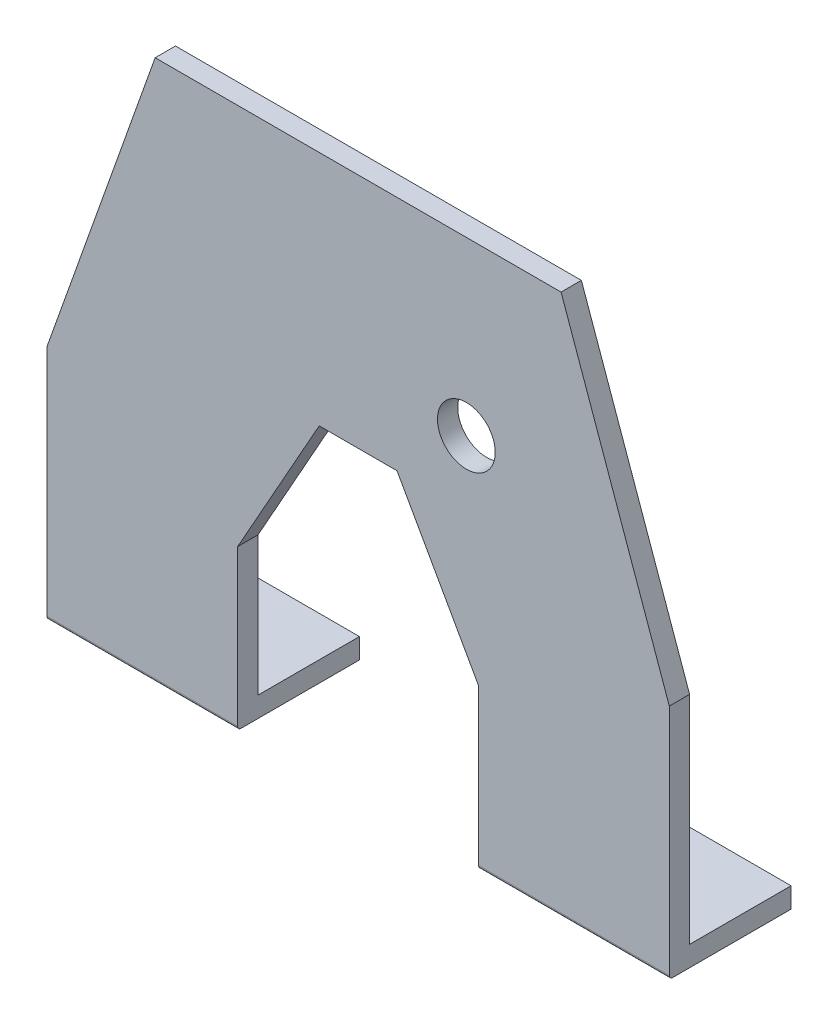
ISO-10303-21;
HEADER;
FILE_DESCRIPTION(('STEP AP214'),'2;1');
FILE_NAME('part.step','',(''),(''),'','','');
FILE_SCHEMA(('AUTOMOTIVE_DESIGN { 1 0 10303 214 1 1 1 1 }'));
ENDSEC;
DATA;
#1=APPLICATION_CONTEXT('core data for automotive mechanical design processes');
#2=APPLICATION_PROTOCOL_DEFINITION('international standard','automotive_design',2000,#1);
#3=PRODUCT_CONTEXT('',#1,'mechanical');
#4=PRODUCT('Part','Part','',(#3));
#5=PRODUCT_RELATED_PRODUCT_CATEGORY('part','',(#4));
#6=PRODUCT_DEFINITION_FORMATION('','',#4);
#7=PRODUCT_DEFINITION_CONTEXT('part definition',#1,'design');
#8=PRODUCT_DEFINITION('design','',#6,#7);
#9=PRODUCT_DEFINITION_SHAPE('','',#8);
#10=(LENGTH_UNIT() NAMED_UNIT(*) SI_UNIT(.MILLI.,.METRE.));
#11=(NAMED_UNIT(*) PLANE_ANGLE_UNIT() SI_UNIT($,.RADIAN.));
#12=(NAMED_UNIT(*) SI_UNIT($,.STERADIAN.) SOLID_ANGLE_UNIT());
#13=UNCERTAINTY_MEASURE_WITH_UNIT(LENGTH_MEASURE(1.E-05),#10,'distance_accuracy_value','');
#14=(GEOMETRIC_REPRESENTATION_CONTEXT(3) GLOBAL_UNCERTAINTY_ASSIGNED_CONTEXT((#13)) GLOBAL_UNIT_ASSIGNED_CONTEXT((#10,
#11,#12)) REPRESENTATION_CONTEXT('',''));
#15=CARTESIAN_POINT('',(0.,0.,0.));
#16=DIRECTION('',(0.,0.,1.));
#17=DIRECTION('',(1.,0.,0.));
#18=AXIS2_PLACEMENT_3D('',#15,#16,#17);
#19=CARTESIAN_POINT('',(0.,0.,0.));
#20=DIRECTION('',(0.,0.,-1.));
#21=DIRECTION('',(-1.,0.,0.));
#22=AXIS2_PLACEMENT_3D('',#19,#20,#21);
#23=PLANE('',#22);
#24=CARTESIAN_POINT('',(16.,14.6,0.));
#25=DIRECTION('',(0.,0.,1.));
#26=DIRECTION('',(1.,0.,0.));
#27=AXIS2_PLACEMENT_3D('',#24,#25,#26);
#28=CIRCLE('',#27,4.27178047631967);
#29=CARTESIAN_POINT('',(20.2717804763197,14.6,0.));
#30=VERTEX_POINT('',#29);
#31=EDGE_CURVE('E210',#30,#30,#28,.T.);
#32=ORIENTED_EDGE('',*,*,#31,.T.);
#33=EDGE_LOOP('',(#32));
#34=FACE_BOUND('',#33,.T.);
#35=DIRECTION('',(0.,1.,0.));
#36=VECTOR('',#35,1.);
#37=CARTESIAN_POINT('',(-17.8038412727349,-16.4842842767622,0.));
#38=LINE('',#37,#36);
#39=CARTESIAN_POINT('',(-17.8038412727349,-37.,0.));
#40=VERTEX_POINT('',#39);
#41=CARTESIAN_POINT('',(-17.8038412727349,-16.4842842767622,0.));
#42=VERTEX_POINT('',#41);
#43=EDGE_CURVE('E251',#40,#42,#38,.T.);
#44=ORIENTED_EDGE('',*,*,#43,.F.);
#45=DIRECTION('',(1.,0.,0.));
#46=VECTOR('',#45,1.);
#47=CARTESIAN_POINT('',(-17.8038412727349,-37.,0.));
#48=LINE('',#47,#46);
#49=CARTESIAN_POINT('',(-46.,-37.,0.));
#50=VERTEX_POINT('',#49);
#51=EDGE_CURVE('E180',#50,#40,#48,.T.);
#52=ORIENTED_EDGE('',*,*,#51,.F.);
#53=DIRECTION('',(0.,-1.,0.));
#54=VECTOR('',#53,1.);
#55=CARTESIAN_POINT('',(-46.,-40.,0.));
#56=LINE('',#55,#54);
#57=CARTESIAN_POINT('',(-46.,-5.,0.));
#58=VERTEX_POINT('',#57);
#59=EDGE_CURVE('E248',#58,#50,#56,.T.);
#60=ORIENTED_EDGE('',*,*,#59,.F.);
#61=DIRECTION('',(-0.335009667654806,-0.942214690279141,0.));
#62=VECTOR('',#61,1.);
#63=CARTESIAN_POINT('',(-46.,-5.,0.));
#64=LINE('',#63,#62);
#65=CARTESIAN_POINT('',(-30.,40.,0.));
#66=VERTEX_POINT('',#65);
#67=EDGE_CURVE('E246',#66,#58,#64,.T.);
#68=ORIENTED_EDGE('',*,*,#67,.F.);
#69=DIRECTION('',(-1.,0.,0.));
#70=VECTOR('',#69,1.);
#71=CARTESIAN_POINT('',(-30.,40.,0.));
#72=LINE('',#71,#70);
#73=CARTESIAN_POINT('',(30.,40.,0.));
#74=VERTEX_POINT('',#73);
#75=EDGE_CURVE('E244',#74,#66,#72,.T.);
#76=ORIENTED_EDGE('',*,*,#75,.F.);
#77=DIRECTION('',(-0.335009667654806,0.942214690279141,0.));
#78=VECTOR('',#77,1.);
#79=CARTESIAN_POINT('',(46.,-4.99999999999999,0.));
#80=LINE('',#79,#78);
#81=CARTESIAN_POINT('',(46.,-4.99999999999999,0.));
#82=VERTEX_POINT('',#81);
#83=EDGE_CURVE('E214',#82,#74,#80,.T.);
#84=ORIENTED_EDGE('',*,*,#83,.F.);
#85=DIRECTION('',(0.,1.,0.));
#86=VECTOR('',#85,1.);
#87=CARTESIAN_POINT('',(46.,-40.,0.));
#88=LINE('',#87,#86);
#89=CARTESIAN_POINT('',(46.,-37.,0.));
#90=VERTEX_POINT('',#89);
#91=EDGE_CURVE('E221',#90,#82,#88,.T.);
#92=ORIENTED_EDGE('',*,*,#91,.F.);
#93=DIRECTION('',(1.,0.,0.));
#94=VECTOR('',#93,1.);
#95=CARTESIAN_POINT('',(46.,-37.,0.));
#96=LINE('',#95,#94);
#97=CARTESIAN_POINT('',(17.8038412727349,-37.,0.));
#98=VERTEX_POINT('',#97);
#99=EDGE_CURVE('E191',#98,#90,#96,.T.);
#100=ORIENTED_EDGE('',*,*,#99,.F.);
#101=DIRECTION('',(0.,-1.,0.));
#102=VECTOR('',#101,1.);
#103=CARTESIAN_POINT('',(17.8038412727349,-16.4842842767622,0.));
#104=LINE('',#103,#102);
#105=CARTESIAN_POINT('',(17.8038412727349,-16.4842842767622,0.));
#106=VERTEX_POINT('',#105);
#107=EDGE_CURVE('E259',#106,#98,#104,.T.);
#108=ORIENTED_EDGE('',*,*,#107,.F.);
#109=DIRECTION('',(0.489302901490051,-0.872113909184699,0.));
#110=VECTOR('',#109,1.);
#111=CARTESIAN_POINT('',(17.8038412727349,-16.4842842767622,0.));
#112=LINE('',#111,#110);
#113=CARTESIAN_POINT('',(5.74999999999989,5.,0.));
#114=VERTEX_POINT('',#113);
#115=EDGE_CURVE('E257',#114,#106,#112,.T.);
#116=ORIENTED_EDGE('',*,*,#115,.F.);
#117=DIRECTION('',(1.,0.,0.));
#118=VECTOR('',#117,1.);
#119=CARTESIAN_POINT('',(-5.74999999999989,5.,0.));
#120=LINE('',#119,#118);
#121=CARTESIAN_POINT('',(-5.74999999999989,5.,0.));
#122=VERTEX_POINT('',#121);
#123=EDGE_CURVE('E255',#122,#114,#120,.T.);
#124=ORIENTED_EDGE('',*,*,#123,.F.);
#125=DIRECTION('',(0.489302901490051,0.872113909184699,0.));
#126=VECTOR('',#125,1.);
#127=CARTESIAN_POINT('',(-17.8038412727349,-16.4842842767622,0.));
#128=LINE('',#127,#126);
#129=EDGE_CURVE('E253',#42,#122,#128,.T.);
#130=ORIENTED_EDGE('',*,*,#129,.F.);
#131=EDGE_LOOP('',(#44,#52,#60,#68,#76,#84,#92,#100,#108,#116,#124,#130));
#132=FACE_BOUND('',#131,.T.);
#133=ADVANCED_FACE('F33',(#34,#132),#23,.T.);
#134=CARTESIAN_POINT('',(0.,0.,3.));
#135=DIRECTION('',(0.,0.,-1.));
#136=DIRECTION('',(-1.,0.,0.));
#137=AXIS2_PLACEMENT_3D('',#134,#135,#136);
#138=PLANE('',#137);
#139=DIRECTION('',(0.,-1.,0.));
#140=VECTOR('',#139,1.);
#141=CARTESIAN_POINT('',(-46.,-40.,3.));
#142=LINE('',#141,#140);
#143=CARTESIAN_POINT('',(-46.,-5.,3.));
#144=VERTEX_POINT('',#143);
#145=CARTESIAN_POINT('',(-46.,-39.5,3.));
#146=VERTEX_POINT('',#145);
#147=EDGE_CURVE('E225',#144,#146,#142,.T.);
#148=ORIENTED_EDGE('',*,*,#147,.T.);
#149=DIRECTION('',(1.,0.,0.));
#150=VECTOR('',#149,1.);
#151=CARTESIAN_POINT('',(0.,-39.5,3.));
#152=LINE('',#151,#150);
#153=CARTESIAN_POINT('',(-17.8038412727349,-39.5,3.));
#154=VERTEX_POINT('',#153);
#155=EDGE_CURVE('E293',#146,#154,#152,.T.);
#156=ORIENTED_EDGE('',*,*,#155,.T.);
#157=DIRECTION('',(0.,1.,0.));
#158=VECTOR('',#157,1.);
#159=CARTESIAN_POINT('',(-17.8038412727349,-16.4842842767622,3.));
#160=LINE('',#159,#158);
#161=CARTESIAN_POINT('',(-17.8038412727349,-16.4842842767622,3.));
#162=VERTEX_POINT('',#161);
#163=EDGE_CURVE('E228',#154,#162,#160,.T.);
#164=ORIENTED_EDGE('',*,*,#163,.T.);
#165=DIRECTION('',(0.489302901490051,0.872113909184699,0.));
#166=VECTOR('',#165,1.);
#167=CARTESIAN_POINT('',(-17.8038412727349,-16.4842842767622,3.));
#168=LINE('',#167,#166);
#169=CARTESIAN_POINT('',(-5.74999999999989,5.,3.));
#170=VERTEX_POINT('',#169);
#171=EDGE_CURVE('E230',#162,#170,#168,.T.);
#172=ORIENTED_EDGE('',*,*,#171,.T.);
#173=DIRECTION('',(1.,0.,0.));
#174=VECTOR('',#173,1.);
#175=CARTESIAN_POINT('',(-5.74999999999989,5.,3.));
#176=LINE('',#175,#174);
#177=CARTESIAN_POINT('',(5.74999999999989,5.,3.));
#178=VERTEX_POINT('',#177);
#179=EDGE_CURVE('E232',#170,#178,#176,.T.);
#180=ORIENTED_EDGE('',*,*,#179,.T.);
#181=DIRECTION('',(0.489302901490051,-0.872113909184699,0.));
#182=VECTOR('',#181,1.);
#183=CARTESIAN_POINT('',(17.8038412727349,-16.4842842767622,3.));
#184=LINE('',#183,#182);
#185=CARTESIAN_POINT('',(17.8038412727349,-16.4842842767622,3.));
#186=VERTEX_POINT('',#185);
#187=EDGE_CURVE('E234',#178,#186,#184,.T.);
#188=ORIENTED_EDGE('',*,*,#187,.T.);
#189=DIRECTION('',(0.,-1.,0.));
#190=VECTOR('',#189,1.);
#191=CARTESIAN_POINT('',(17.8038412727349,-16.4842842767622,3.));
#192=LINE('',#191,#190);
#193=CARTESIAN_POINT('',(17.8038412727349,-39.5,3.));
#194=VERTEX_POINT('',#193);
#195=EDGE_CURVE('E236',#186,#194,#192,.T.);
#196=ORIENTED_EDGE('',*,*,#195,.T.);
#197=DIRECTION('',(1.,0.,0.));
#198=VECTOR('',#197,1.);
#199=CARTESIAN_POINT('',(0.,-39.5,3.));
#200=LINE('',#199,#198);
#201=CARTESIAN_POINT('',(46.,-39.5,3.));
#202=VERTEX_POINT('',#201);
#203=EDGE_CURVE('E290',#194,#202,#200,.T.);
#204=ORIENTED_EDGE('',*,*,#203,.T.);
#205=DIRECTION('',(0.,1.,0.));
#206=VECTOR('',#205,1.);
#207=CARTESIAN_POINT('',(46.,-40.,3.));
#208=LINE('',#207,#206);
#209=CARTESIAN_POINT('',(46.,-4.99999999999999,3.));
#210=VERTEX_POINT('',#209);
#211=EDGE_CURVE('E239',#202,#210,#208,.T.);
#212=ORIENTED_EDGE('',*,*,#211,.T.);
#213=DIRECTION('',(-0.335009667654806,0.942214690279141,0.));
#214=VECTOR('',#213,1.);
#215=CARTESIAN_POINT('',(46.,-4.99999999999999,3.));
#216=LINE('',#215,#214);
#217=CARTESIAN_POINT('',(30.,40.,3.));
#218=VERTEX_POINT('',#217);
#219=EDGE_CURVE('E217',#210,#218,#216,.T.);
#220=ORIENTED_EDGE('',*,*,#219,.T.);
#221=DIRECTION('',(-1.,0.,0.));
#222=VECTOR('',#221,1.);
#223=CARTESIAN_POINT('',(-30.,40.,3.));
#224=LINE('',#223,#222);
#225=CARTESIAN_POINT('',(-30.,40.,3.));
#226=VERTEX_POINT('',#225);
#227=EDGE_CURVE('E220',#218,#226,#224,.T.);
#228=ORIENTED_EDGE('',*,*,#227,.T.);
#229=DIRECTION('',(-0.335009667654806,-0.942214690279141,0.));
#230=VECTOR('',#229,1.);
#231=CARTESIAN_POINT('',(-46.,-5.,3.));
#232=LINE('',#231,#230);
#233=EDGE_CURVE('E223',#226,#144,#232,.T.);
#234=ORIENTED_EDGE('',*,*,#233,.T.);
#235=EDGE_LOOP('',(#148,#156,#164,#172,#180,#188,#196,#204,#212,#220,#228,#234));
#236=FACE_BOUND('',#235,.T.);
#237=CARTESIAN_POINT('',(16.,14.6,3.));
#238=DIRECTION('',(0.,0.,1.));
#239=DIRECTION('',(1.,0.,0.));
#240=AXIS2_PLACEMENT_3D('',#237,#238,#239);
#241=CIRCLE('',#240,4.27178047631967);
#242=CARTESIAN_POINT('',(20.2717804763197,14.6,3.));
#243=VERTEX_POINT('',#242);
#244=EDGE_CURVE('E211',#243,#243,#241,.T.);
#245=ORIENTED_EDGE('',*,*,#244,.F.);
#246=EDGE_LOOP('',(#245));
#247=FACE_BOUND('',#246,.T.);
#248=ADVANCED_FACE('F308',(#236,#247),#138,.F.);
#249=CARTESIAN_POINT('',(46.,-4.99999999999999,3.));
#250=DIRECTION('',(-0.94221469027914,-0.335009667654806,0.));
#251=DIRECTION('',(0.335009667654806,-0.942214690279141,0.));
#252=AXIS2_PLACEMENT_3D('',#249,#250,#251);
#253=PLANE('',#252);
#254=ORIENTED_EDGE('',*,*,#83,.T.);
#255=DIRECTION('',(0.,0.,-1.));
#256=VECTOR('',#255,1.);
#257=CARTESIAN_POINT('',(30.,40.,3.));
#258=LINE('',#257,#256);
#259=EDGE_CURVE('E287',#218,#74,#258,.T.);
#260=ORIENTED_EDGE('',*,*,#259,.F.);
#261=ORIENTED_EDGE('',*,*,#219,.F.);
#262=DIRECTION('',(0.,0.,-1.));
#263=VECTOR('',#262,1.);
#264=CARTESIAN_POINT('',(46.,-4.99999999999999,3.));
#265=LINE('',#264,#263);
#266=EDGE_CURVE('E241',#210,#82,#265,.T.);
#267=ORIENTED_EDGE('',*,*,#266,.T.);
#268=EDGE_LOOP('',(#254,#260,#261,#267));
#269=FACE_BOUND('',#268,.T.);
#270=ADVANCED_FACE('F328',(#269),#253,.F.);
#271=CARTESIAN_POINT('',(-30.,40.,3.));
#272=DIRECTION('',(0.,-1.,0.));
#273=DIRECTION('',(1.,0.,0.));
#274=AXIS2_PLACEMENT_3D('',#271,#272,#273);
#275=PLANE('',#274);
#276=ORIENTED_EDGE('',*,*,#75,.T.);
#277=DIRECTION('',(0.,0.,-1.));
#278=VECTOR('',#277,1.);
#279=CARTESIAN_POINT('',(-30.,40.,3.));
#280=LINE('',#279,#278);
#281=EDGE_CURVE('E284',#226,#66,#280,.T.);
#282=ORIENTED_EDGE('',*,*,#281,.F.);
#283=ORIENTED_EDGE('',*,*,#227,.F.);
#284=ORIENTED_EDGE('',*,*,#259,.T.);
#285=EDGE_LOOP('',(#276,#282,#283,#284));
#286=FACE_BOUND('',#285,.T.);
#287=ADVANCED_FACE('F365',(#286),#275,.F.);
#288=CARTESIAN_POINT('',(-46.,-5.,3.));
#289=DIRECTION('',(0.94221469027914,-0.335009667654805,0.));
#290=DIRECTION('',(0.335009667654805,0.942214690279141,0.));
#291=AXIS2_PLACEMENT_3D('',#288,#289,#290);
#292=PLANE('',#291);
#293=ORIENTED_EDGE('',*,*,#67,.T.);
#294=DIRECTION('',(0.,0.,-1.));
#295=VECTOR('',#294,1.);
#296=CARTESIAN_POINT('',(-46.,-5.,3.));
#297=LINE('',#296,#295);
#298=EDGE_CURVE('E281',#144,#58,#297,.T.);
#299=ORIENTED_EDGE('',*,*,#298,.F.);
#300=ORIENTED_EDGE('',*,*,#233,.F.);
#301=ORIENTED_EDGE('',*,*,#281,.T.);
#302=EDGE_LOOP('',(#293,#299,#300,#301));
#303=FACE_BOUND('',#302,.T.);
#304=ADVANCED_FACE('F362',(#303),#292,.F.);
#305=CARTESIAN_POINT('',(-46.,-40.,3.));
#306=DIRECTION('',(1.,0.,0.));
#307=DIRECTION('',(0.,0.,-1.));
#308=AXIS2_PLACEMENT_3D('',#305,#306,#307);
#309=PLANE('',#308);
#310=DIRECTION('',(0.,0.,-1.));
#311=VECTOR('',#310,1.);
#312=CARTESIAN_POINT('',(-46.,-40.,3.));
#313=LINE('',#312,#311);
#314=CARTESIAN_POINT('',(-46.,-40.,2.5));
#315=VERTEX_POINT('',#314);
#316=CARTESIAN_POINT('',(-46.,-40.,-15.));
#317=VERTEX_POINT('',#316);
#318=EDGE_CURVE('E165',#315,#317,#313,.T.);
#319=ORIENTED_EDGE('',*,*,#318,.F.);
#320=CARTESIAN_POINT('',(-46.,-39.5,2.5));
#321=DIRECTION('',(1.,0.,0.));
#322=DIRECTION('',(0.,0.,-1.));
#323=AXIS2_PLACEMENT_3D('',#320,#321,#322);
#324=CIRCLE('',#323,0.5);
#325=EDGE_CURVE('E299',#315,#146,#324,.F.);
#326=ORIENTED_EDGE('',*,*,#325,.T.);
#327=ORIENTED_EDGE('',*,*,#147,.F.);
#328=ORIENTED_EDGE('',*,*,#298,.T.);
#329=ORIENTED_EDGE('',*,*,#59,.T.);
#330=DIRECTION('',(0.,0.,1.));
#331=VECTOR('',#330,1.);
#332=CARTESIAN_POINT('',(-46.,-37.,-15.));
#333=LINE('',#332,#331);
#334=CARTESIAN_POINT('',(-46.,-37.,-15.));
#335=VERTEX_POINT('',#334);
#336=EDGE_CURVE('E189',#335,#50,#333,.T.);
#337=ORIENTED_EDGE('',*,*,#336,.F.);
#338=DIRECTION('',(0.,1.,0.));
#339=VECTOR('',#338,1.);
#340=CARTESIAN_POINT('',(-46.,-40.,-15.));
#341=LINE('',#340,#339);
#342=EDGE_CURVE('E174',#317,#335,#341,.T.);
#343=ORIENTED_EDGE('',*,*,#342,.F.);
#344=EDGE_LOOP('',(#319,#326,#327,#328,#329,#337,#343));
#345=FACE_BOUND('',#344,.T.);
#346=ADVANCED_FACE('F304',(#345),#309,.F.);
#347=CARTESIAN_POINT('',(-46.,-40.,3.));
#348=DIRECTION('',(0.,1.,0.));
#349=DIRECTION('',(0.,0.,1.));
#350=AXIS2_PLACEMENT_3D('',#347,#348,#349);
#351=PLANE('',#350);
#352=DIRECTION('',(0.,0.,-1.));
#353=VECTOR('',#352,1.);
#354=CARTESIAN_POINT('',(-17.8038412727349,-40.,3.));
#355=LINE('',#354,#353);
#356=CARTESIAN_POINT('',(-17.8038412727349,-40.,2.5));
#357=VERTEX_POINT('',#356);
#358=CARTESIAN_POINT('',(-17.8038412727349,-40.,-15.));
#359=VERTEX_POINT('',#358);
#360=EDGE_CURVE('E156',#357,#359,#355,.T.);
#361=ORIENTED_EDGE('',*,*,#360,.F.);
#362=DIRECTION('',(1.,0.,0.));
#363=VECTOR('',#362,1.);
#364=CARTESIAN_POINT('',(-46.,-40.,2.5));
#365=LINE('',#364,#363);
#366=EDGE_CURVE('E297',#357,#315,#365,.F.);
#367=ORIENTED_EDGE('',*,*,#366,.T.);
#368=ORIENTED_EDGE('',*,*,#318,.T.);
#369=DIRECTION('',(-1.,0.,0.));
#370=VECTOR('',#369,1.);
#371=CARTESIAN_POINT('',(-17.8038412727349,-40.,-15.));
#372=LINE('',#371,#370);
#373=EDGE_CURVE('E169',#359,#317,#372,.T.);
#374=ORIENTED_EDGE('',*,*,#373,.F.);
#375=EDGE_LOOP('',(#361,#367,#368,#374));
#376=FACE_BOUND('',#375,.T.);
#377=ADVANCED_FACE('F170',(#376),#351,.F.);
#378=CARTESIAN_POINT('',(-17.8038412727349,-16.4842842767622,3.));
#379=DIRECTION('',(-1.,0.,0.));
#380=DIRECTION('',(0.,0.,1.));
#381=AXIS2_PLACEMENT_3D('',#378,#379,#380);
#382=PLANE('',#381);
#383=ORIENTED_EDGE('',*,*,#163,.F.);
#384=CARTESIAN_POINT('',(-17.8038412727349,-39.5,2.5));
#385=DIRECTION('',(-1.,0.,0.));
#386=DIRECTION('',(0.,0.,1.));
#387=AXIS2_PLACEMENT_3D('',#384,#385,#386);
#388=CIRCLE('',#387,0.5);
#389=EDGE_CURVE('E162',#154,#357,#388,.F.);
#390=ORIENTED_EDGE('',*,*,#389,.T.);
#391=ORIENTED_EDGE('',*,*,#360,.T.);
#392=DIRECTION('',(0.,-1.,0.));
#393=VECTOR('',#392,1.);
#394=CARTESIAN_POINT('',(-17.8038412727349,-40.,-15.));
#395=LINE('',#394,#393);
#396=CARTESIAN_POINT('',(-17.8038412727349,-37.,-15.));
#397=VERTEX_POINT('',#396);
#398=EDGE_CURVE('E161',#397,#359,#395,.T.);
#399=ORIENTED_EDGE('',*,*,#398,.F.);
#400=DIRECTION('',(0.,0.,1.));
#401=VECTOR('',#400,1.);
#402=CARTESIAN_POINT('',(-17.8038412727349,-37.,-15.));
#403=LINE('',#402,#401);
#404=EDGE_CURVE('E186',#397,#40,#403,.T.);
#405=ORIENTED_EDGE('',*,*,#404,.T.);
#406=ORIENTED_EDGE('',*,*,#43,.T.);
#407=DIRECTION('',(0.,0.,-1.));
#408=VECTOR('',#407,1.);
#409=CARTESIAN_POINT('',(-17.8038412727349,-16.4842842767622,3.));
#410=LINE('',#409,#408);
#411=EDGE_CURVE('E166',#162,#42,#410,.T.);
#412=ORIENTED_EDGE('',*,*,#411,.F.);
#413=EDGE_LOOP('',(#383,#390,#391,#399,#405,#406,#412));
#414=FACE_BOUND('',#413,.T.);
#415=ADVANCED_FACE('F159',(#414),#382,.F.);
#416=CARTESIAN_POINT('',(-17.8038412727349,-16.4842842767622,3.));
#417=DIRECTION('',(-0.872113909184699,0.48930290149005,0.));
#418=DIRECTION('',(-0.489302901490051,-0.872113909184699,0.));
#419=AXIS2_PLACEMENT_3D('',#416,#417,#418);
#420=PLANE('',#419);
#421=ORIENTED_EDGE('',*,*,#129,.T.);
#422=DIRECTION('',(0.,0.,-1.));
#423=VECTOR('',#422,1.);
#424=CARTESIAN_POINT('',(-5.74999999999989,5.,3.));
#425=LINE('',#424,#423);
#426=EDGE_CURVE('E275',#170,#122,#425,.T.);
#427=ORIENTED_EDGE('',*,*,#426,.F.);
#428=ORIENTED_EDGE('',*,*,#171,.F.);
#429=ORIENTED_EDGE('',*,*,#411,.T.);
#430=EDGE_LOOP('',(#421,#427,#428,#429));
#431=FACE_BOUND('',#430,.T.);
#432=ADVANCED_FACE('F351',(#431),#420,.F.);
#433=CARTESIAN_POINT('',(-5.74999999999989,5.,3.));
#434=DIRECTION('',(0.,1.,0.));
#435=DIRECTION('',(-1.,0.,0.));
#436=AXIS2_PLACEMENT_3D('',#433,#434,#435);
#437=PLANE('',#436);
#438=ORIENTED_EDGE('',*,*,#123,.T.);
#439=DIRECTION('',(0.,0.,-1.));
#440=VECTOR('',#439,1.);
#441=CARTESIAN_POINT('',(5.74999999999989,5.,3.));
#442=LINE('',#441,#440);
#443=EDGE_CURVE('E272',#178,#114,#442,.T.);
#444=ORIENTED_EDGE('',*,*,#443,.F.);
#445=ORIENTED_EDGE('',*,*,#179,.F.);
#446=ORIENTED_EDGE('',*,*,#426,.T.);
#447=EDGE_LOOP('',(#438,#444,#445,#446));
#448=FACE_BOUND('',#447,.T.);
#449=ADVANCED_FACE('F347',(#448),#437,.F.);
#450=CARTESIAN_POINT('',(17.8038412727349,-16.4842842767622,3.));
#451=DIRECTION('',(0.872113909184699,0.489302901490051,0.));
#452=DIRECTION('',(-0.489302901490051,0.872113909184699,0.));
#453=AXIS2_PLACEMENT_3D('',#450,#451,#452);
#454=PLANE('',#453);
#455=ORIENTED_EDGE('',*,*,#115,.T.);
#456=DIRECTION('',(0.,0.,-1.));
#457=VECTOR('',#456,1.);
#458=CARTESIAN_POINT('',(17.8038412727349,-16.4842842767622,3.));
#459=LINE('',#458,#457);
#460=EDGE_CURVE('E269',#186,#106,#459,.T.);
#461=ORIENTED_EDGE('',*,*,#460,.F.);
#462=ORIENTED_EDGE('',*,*,#187,.F.);
#463=ORIENTED_EDGE('',*,*,#443,.T.);
#464=EDGE_LOOP('',(#455,#461,#462,#463));
#465=FACE_BOUND('',#464,.T.);
#466=ADVANCED_FACE('F343',(#465),#454,.F.);
#467=CARTESIAN_POINT('',(17.8038412727349,-16.4842842767622,3.));
#468=DIRECTION('',(1.,0.,0.));
#469=DIRECTION('',(0.,0.,-1.));
#470=AXIS2_PLACEMENT_3D('',#467,#468,#469);
#471=PLANE('',#470);
#472=DIRECTION('',(0.,0.,-1.));
#473=VECTOR('',#472,1.);
#474=CARTESIAN_POINT('',(17.8038412727349,-40.,3.));
#475=LINE('',#474,#473);
#476=CARTESIAN_POINT('',(17.8038412727349,-40.,2.5));
#477=VERTEX_POINT('',#476);
#478=CARTESIAN_POINT('',(17.8038412727349,-40.,-15.));
#479=VERTEX_POINT('',#478);
#480=EDGE_CURVE('E267',#477,#479,#475,.T.);
#481=ORIENTED_EDGE('',*,*,#480,.F.);
#482=CARTESIAN_POINT('',(17.8038412727349,-39.5,2.5));
#483=DIRECTION('',(1.,0.,0.));
#484=DIRECTION('',(0.,0.,-1.));
#485=AXIS2_PLACEMENT_3D('',#482,#483,#484);
#486=CIRCLE('',#485,0.5);
#487=EDGE_CURVE('E11',#477,#194,#486,.F.);
#488=ORIENTED_EDGE('',*,*,#487,.T.);
#489=ORIENTED_EDGE('',*,*,#195,.F.);
#490=ORIENTED_EDGE('',*,*,#460,.T.);
#491=ORIENTED_EDGE('',*,*,#107,.T.);
#492=DIRECTION('',(0.,0.,1.));
#493=VECTOR('',#492,1.);
#494=CARTESIAN_POINT('',(17.8038412727349,-37.,-15.));
#495=LINE('',#494,#493);
#496=CARTESIAN_POINT('',(17.8038412727349,-37.,-15.));
#497=VERTEX_POINT('',#496);
#498=EDGE_CURVE('E207',#497,#98,#495,.T.);
#499=ORIENTED_EDGE('',*,*,#498,.F.);
#500=DIRECTION('',(0.,1.,0.));
#501=VECTOR('',#500,1.);
#502=CARTESIAN_POINT('',(17.8038412727349,-40.,-15.));
#503=LINE('',#502,#501);
#504=EDGE_CURVE('E198',#479,#497,#503,.T.);
#505=ORIENTED_EDGE('',*,*,#504,.F.);
#506=EDGE_LOOP('',(#481,#488,#489,#490,#491,#499,#505));
#507=FACE_BOUND('',#506,.T.);
#508=ADVANCED_FACE('F340',(#507),#471,.F.);
#509=CARTESIAN_POINT('',(17.8038412727349,-40.,3.));
#510=DIRECTION('',(0.,1.,0.));
#511=DIRECTION('',(-1.,0.,0.));
#512=AXIS2_PLACEMENT_3D('',#509,#510,#511);
#513=PLANE('',#512);
#514=DIRECTION('',(0.,0.,-1.));
#515=VECTOR('',#514,1.);
#516=CARTESIAN_POINT('',(46.,-40.,3.));
#517=LINE('',#516,#515);
#518=CARTESIAN_POINT('',(46.,-40.,2.5));
#519=VERTEX_POINT('',#518);
#520=CARTESIAN_POINT('',(46.,-40.,-15.));
#521=VERTEX_POINT('',#520);
#522=EDGE_CURVE('E265',#519,#521,#517,.T.);
#523=ORIENTED_EDGE('',*,*,#522,.F.);
#524=DIRECTION('',(1.,0.,0.));
#525=VECTOR('',#524,1.);
#526=CARTESIAN_POINT('',(17.8038412727349,-40.,2.5));
#527=LINE('',#526,#525);
#528=EDGE_CURVE('E41',#519,#477,#527,.F.);
#529=ORIENTED_EDGE('',*,*,#528,.T.);
#530=ORIENTED_EDGE('',*,*,#480,.T.);
#531=DIRECTION('',(-1.,0.,0.));
#532=VECTOR('',#531,1.);
#533=CARTESIAN_POINT('',(46.,-40.,-15.));
#534=LINE('',#533,#532);
#535=EDGE_CURVE('E195',#521,#479,#534,.T.);
#536=ORIENTED_EDGE('',*,*,#535,.F.);
#537=EDGE_LOOP('',(#523,#529,#530,#536));
#538=FACE_BOUND('',#537,.T.);
#539=ADVANCED_FACE('F337',(#538),#513,.F.);
#540=CARTESIAN_POINT('',(46.,-40.,3.));
#541=DIRECTION('',(-1.,0.,0.));
#542=DIRECTION('',(0.,0.,1.));
#543=AXIS2_PLACEMENT_3D('',#540,#541,#542);
#544=PLANE('',#543);
#545=ORIENTED_EDGE('',*,*,#211,.F.);
#546=CARTESIAN_POINT('',(46.,-39.5,2.5));
#547=DIRECTION('',(-1.,0.,0.));
#548=DIRECTION('',(0.,0.,1.));
#549=AXIS2_PLACEMENT_3D('',#546,#547,#548);
#550=CIRCLE('',#549,0.5);
#551=EDGE_CURVE('E55',#202,#519,#550,.F.);
#552=ORIENTED_EDGE('',*,*,#551,.T.);
#553=ORIENTED_EDGE('',*,*,#522,.T.);
#554=DIRECTION('',(0.,-1.,0.));
#555=VECTOR('',#554,1.);
#556=CARTESIAN_POINT('',(46.,-40.,-15.));
#557=LINE('',#556,#555);
#558=CARTESIAN_POINT('',(46.,-37.,-15.));
#559=VERTEX_POINT('',#558);
#560=EDGE_CURVE('E192',#559,#521,#557,.T.);
#561=ORIENTED_EDGE('',*,*,#560,.F.);
#562=DIRECTION('',(0.,0.,1.));
#563=VECTOR('',#562,1.);
#564=CARTESIAN_POINT('',(46.,-37.,-15.));
#565=LINE('',#564,#563);
#566=EDGE_CURVE('E202',#559,#90,#565,.T.);
#567=ORIENTED_EDGE('',*,*,#566,.T.);
#568=ORIENTED_EDGE('',*,*,#91,.T.);
#569=ORIENTED_EDGE('',*,*,#266,.F.);
#570=EDGE_LOOP('',(#545,#552,#553,#561,#567,#568,#569));
#571=FACE_BOUND('',#570,.T.);
#572=ADVANCED_FACE('F333',(#571),#544,.F.);
#573=CARTESIAN_POINT('',(16.,14.6,3.));
#574=DIRECTION('',(0.,0.,-1.));
#575=DIRECTION('',(-1.,0.,0.));
#576=AXIS2_PLACEMENT_3D('',#573,#574,#575);
#577=CYLINDRICAL_SURFACE('',#576,4.27178047631967);
#578=ORIENTED_EDGE('',*,*,#244,.T.);
#579=EDGE_LOOP('',(#578));
#580=FACE_BOUND('',#579,.T.);
#581=ORIENTED_EDGE('',*,*,#31,.F.);
#582=EDGE_LOOP('',(#581));
#583=FACE_BOUND('',#582,.T.);
#584=ADVANCED_FACE('F336',(#580,#583),#577,.F.);
#585=CARTESIAN_POINT('',(46.,-37.,-15.));
#586=DIRECTION('',(0.,-1.,0.));
#587=DIRECTION('',(0.,0.,-1.));
#588=AXIS2_PLACEMENT_3D('',#585,#586,#587);
#589=PLANE('',#588);
#590=ORIENTED_EDGE('',*,*,#99,.T.);
#591=ORIENTED_EDGE('',*,*,#566,.F.);
#592=DIRECTION('',(1.,0.,0.));
#593=VECTOR('',#592,1.);
#594=CARTESIAN_POINT('',(46.,-37.,-15.));
#595=LINE('',#594,#593);
#596=EDGE_CURVE('E200',#497,#559,#595,.T.);
#597=ORIENTED_EDGE('',*,*,#596,.F.);
#598=ORIENTED_EDGE('',*,*,#498,.T.);
#599=EDGE_LOOP('',(#590,#591,#597,#598));
#600=FACE_BOUND('',#599,.T.);
#601=ADVANCED_FACE('F386',(#600),#589,.F.);
#602=CARTESIAN_POINT('',(0.,0.,-15.));
#603=DIRECTION('',(0.,0.,1.));
#604=DIRECTION('',(1.,0.,0.));
#605=AXIS2_PLACEMENT_3D('',#602,#603,#604);
#606=PLANE('',#605);
#607=ORIENTED_EDGE('',*,*,#560,.T.);
#608=ORIENTED_EDGE('',*,*,#535,.T.);
#609=ORIENTED_EDGE('',*,*,#504,.T.);
#610=ORIENTED_EDGE('',*,*,#596,.T.);
#611=EDGE_LOOP('',(#607,#608,#609,#610));
#612=FACE_BOUND('',#611,.T.);
#613=ADVANCED_FACE('F405',(#612),#606,.F.);
#614=CARTESIAN_POINT('',(-17.8038412727349,-37.,-15.));
#615=DIRECTION('',(0.,-1.,0.));
#616=DIRECTION('',(0.,0.,-1.));
#617=AXIS2_PLACEMENT_3D('',#614,#615,#616);
#618=PLANE('',#617);
#619=ORIENTED_EDGE('',*,*,#51,.T.);
#620=ORIENTED_EDGE('',*,*,#404,.F.);
#621=DIRECTION('',(1.,0.,0.));
#622=VECTOR('',#621,1.);
#623=CARTESIAN_POINT('',(-17.8038412727349,-37.,-15.));
#624=LINE('',#623,#622);
#625=EDGE_CURVE('E178',#335,#397,#624,.T.);
#626=ORIENTED_EDGE('',*,*,#625,.F.);
#627=ORIENTED_EDGE('',*,*,#336,.T.);
#628=EDGE_LOOP('',(#619,#620,#626,#627));
#629=FACE_BOUND('',#628,.T.);
#630=ADVANCED_FACE('F319',(#629),#618,.F.);
#631=CARTESIAN_POINT('',(0.,0.,-15.));
#632=DIRECTION('',(0.,0.,1.));
#633=DIRECTION('',(1.,0.,0.));
#634=AXIS2_PLACEMENT_3D('',#631,#632,#633);
#635=PLANE('',#634);
#636=ORIENTED_EDGE('',*,*,#398,.T.);
#637=ORIENTED_EDGE('',*,*,#373,.T.);
#638=ORIENTED_EDGE('',*,*,#342,.T.);
#639=ORIENTED_EDGE('',*,*,#625,.T.);
#640=EDGE_LOOP('',(#636,#637,#638,#639));
#641=FACE_BOUND('',#640,.T.);
#642=ADVANCED_FACE('F176',(#641),#635,.F.);
#643=CARTESIAN_POINT('',(0.,-39.5,2.5));
#644=DIRECTION('',(1.,0.,0.));
#645=DIRECTION('',(0.,0.,-1.));
#646=AXIS2_PLACEMENT_3D('',#643,#644,#645);
#647=CYLINDRICAL_SURFACE('',#646,0.5);
#648=ORIENTED_EDGE('',*,*,#325,.F.);
#649=ORIENTED_EDGE('',*,*,#366,.F.);
#650=ORIENTED_EDGE('',*,*,#389,.F.);
#651=ORIENTED_EDGE('',*,*,#155,.F.);
#652=EDGE_LOOP('',(#648,#649,#650,#651));
#653=FACE_BOUND('',#652,.T.);
#654=ADVANCED_FACE('F312',(#653),#647,.T.);
#655=CARTESIAN_POINT('',(0.,-39.5,2.5));
#656=DIRECTION('',(1.,0.,0.));
#657=DIRECTION('',(0.,1.,0.));
#658=AXIS2_PLACEMENT_3D('',#655,#656,#657);
#659=CYLINDRICAL_SURFACE('',#658,0.5);
#660=ORIENTED_EDGE('',*,*,#487,.F.);
#661=ORIENTED_EDGE('',*,*,#528,.F.);
#662=ORIENTED_EDGE('',*,*,#551,.F.);
#663=ORIENTED_EDGE('',*,*,#203,.F.);
#664=EDGE_LOOP('',(#660,#661,#662,#663));
#665=FACE_BOUND('',#664,.T.);
#666=ADVANCED_FACE('F35',(#665),#659,.T.);
#667=CLOSED_SHELL('',(#133,#248,#270,#287,#304,#346,#377,#415,#432,#449,#466,#508,#539,#572,
#584,#601,#613,#630,#642,#654,#666));
#668=MANIFOLD_SOLID_BREP('B2',#667);
#669=ADVANCED_BREP_SHAPE_REPRESENTATION('',(#18,#668),#14);
#670=SHAPE_DEFINITION_REPRESENTATION(#9,#669);
ENDSEC;
END-ISO-10303-21;
